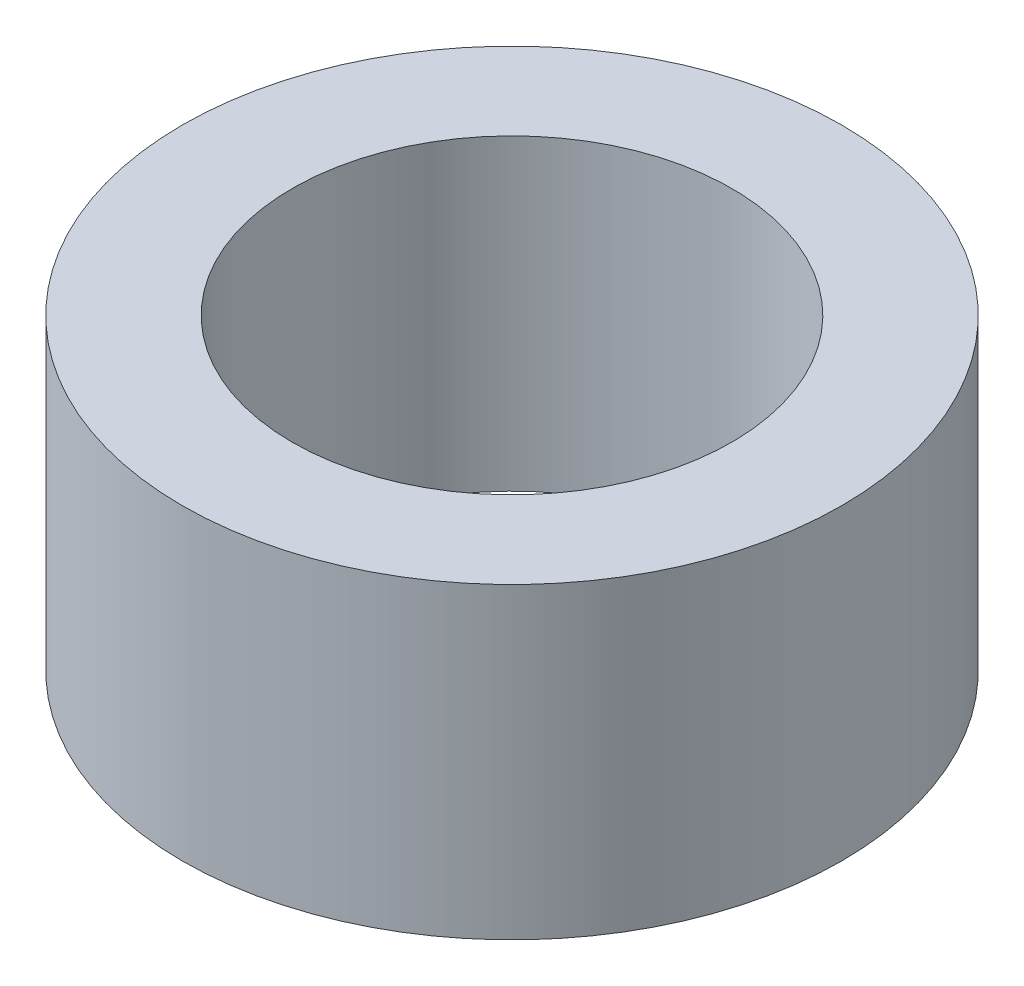
ISO-10303-21;
HEADER;
FILE_DESCRIPTION(('STEP AP214'),'2;1');
FILE_NAME('part.step','',(''),(''),'','','');
FILE_SCHEMA(('AUTOMOTIVE_DESIGN { 1 0 10303 214 1 1 1 1 }'));
ENDSEC;
DATA;
#1=APPLICATION_CONTEXT('core data for automotive mechanical design processes');
#2=APPLICATION_PROTOCOL_DEFINITION('international standard','automotive_design',2000,#1);
#3=PRODUCT_CONTEXT('',#1,'mechanical');
#4=PRODUCT('Part','Part','',(#3));
#5=PRODUCT_RELATED_PRODUCT_CATEGORY('part','',(#4));
#6=PRODUCT_DEFINITION_FORMATION('','',#4);
#7=PRODUCT_DEFINITION_CONTEXT('part definition',#1,'design');
#8=PRODUCT_DEFINITION('design','',#6,#7);
#9=PRODUCT_DEFINITION_SHAPE('','',#8);
#10=(LENGTH_UNIT() NAMED_UNIT(*) SI_UNIT(.MILLI.,.METRE.));
#11=(NAMED_UNIT(*) PLANE_ANGLE_UNIT() SI_UNIT($,.RADIAN.));
#12=(NAMED_UNIT(*) SI_UNIT($,.STERADIAN.) SOLID_ANGLE_UNIT());
#13=UNCERTAINTY_MEASURE_WITH_UNIT(LENGTH_MEASURE(1.E-05),#10,'distance_accuracy_value','');
#14=(GEOMETRIC_REPRESENTATION_CONTEXT(3) GLOBAL_UNCERTAINTY_ASSIGNED_CONTEXT((#13)) GLOBAL_UNIT_ASSIGNED_CONTEXT((#10,
#11,#12)) REPRESENTATION_CONTEXT('',''));
#15=CARTESIAN_POINT('',(0.,0.,0.));
#16=DIRECTION('',(0.,0.,1.));
#17=DIRECTION('',(1.,0.,0.));
#18=AXIS2_PLACEMENT_3D('',#15,#16,#17);
#19=CARTESIAN_POINT('',(0.,28.,0.));
#20=DIRECTION('',(0.,1.,0.));
#21=DIRECTION('',(0.,0.,1.));
#22=AXIS2_PLACEMENT_3D('',#19,#20,#21);
#23=PLANE('',#22);
#24=CARTESIAN_POINT('',(0.,28.,0.));
#25=DIRECTION('',(0.,1.,0.));
#26=DIRECTION('',(0.,0.,1.));
#27=AXIS2_PLACEMENT_3D('',#24,#25,#26);
#28=CIRCLE('',#27,30.);
#29=CARTESIAN_POINT('',(0.,28.,30.));
#30=VERTEX_POINT('',#29);
#31=EDGE_CURVE('E10',#30,#30,#28,.T.);
#32=ORIENTED_EDGE('',*,*,#31,.T.);
#33=EDGE_LOOP('',(#32));
#34=FACE_BOUND('',#33,.T.);
#35=CARTESIAN_POINT('',(0.,28.,0.));
#36=DIRECTION('',(0.,1.,0.));
#37=DIRECTION('',(0.,0.,1.));
#38=AXIS2_PLACEMENT_3D('',#35,#36,#37);
#39=CIRCLE('',#38,20.);
#40=CARTESIAN_POINT('',(0.,28.,20.));
#41=VERTEX_POINT('',#40);
#42=EDGE_CURVE('E52',#41,#41,#39,.T.);
#43=ORIENTED_EDGE('',*,*,#42,.F.);
#44=EDGE_LOOP('',(#43));
#45=FACE_BOUND('',#44,.T.);
#46=ADVANCED_FACE('F39',(#34,#45),#23,.T.);
#47=CARTESIAN_POINT('',(0.,0.,0.));
#48=DIRECTION('',(0.,1.,0.));
#49=DIRECTION('',(0.,0.,1.));
#50=AXIS2_PLACEMENT_3D('',#47,#48,#49);
#51=PLANE('',#50);
#52=CARTESIAN_POINT('',(0.,0.,0.));
#53=DIRECTION('',(0.,1.,0.));
#54=DIRECTION('',(0.,0.,1.));
#55=AXIS2_PLACEMENT_3D('',#52,#53,#54);
#56=CIRCLE('',#55,30.);
#57=CARTESIAN_POINT('',(0.,0.,30.));
#58=VERTEX_POINT('',#57);
#59=EDGE_CURVE('E43',#58,#58,#56,.T.);
#60=ORIENTED_EDGE('',*,*,#59,.F.);
#61=EDGE_LOOP('',(#60));
#62=FACE_BOUND('',#61,.T.);
#63=CARTESIAN_POINT('',(0.,0.,0.));
#64=DIRECTION('',(0.,1.,0.));
#65=DIRECTION('',(0.,0.,1.));
#66=AXIS2_PLACEMENT_3D('',#63,#64,#65);
#67=CIRCLE('',#66,20.);
#68=CARTESIAN_POINT('',(0.,0.,20.));
#69=VERTEX_POINT('',#68);
#70=EDGE_CURVE('E54',#69,#69,#67,.T.);
#71=ORIENTED_EDGE('',*,*,#70,.T.);
#72=EDGE_LOOP('',(#71));
#73=FACE_BOUND('',#72,.T.);
#74=ADVANCED_FACE('F66',(#62,#73),#51,.F.);
#75=CARTESIAN_POINT('',(0.,28.,0.));
#76=DIRECTION('',(0.,-1.,0.));
#77=DIRECTION('',(0.,0.,-1.));
#78=AXIS2_PLACEMENT_3D('',#75,#76,#77);
#79=CYLINDRICAL_SURFACE('',#78,30.);
#80=ORIENTED_EDGE('',*,*,#31,.F.);
#81=EDGE_LOOP('',(#80));
#82=FACE_BOUND('',#81,.T.);
#83=ORIENTED_EDGE('',*,*,#59,.T.);
#84=EDGE_LOOP('',(#83));
#85=FACE_BOUND('',#84,.T.);
#86=ADVANCED_FACE('F41',(#82,#85),#79,.T.);
#87=CARTESIAN_POINT('',(0.,28.,0.));
#88=DIRECTION('',(0.,-1.,0.));
#89=DIRECTION('',(0.,0.,-1.));
#90=AXIS2_PLACEMENT_3D('',#87,#88,#89);
#91=CYLINDRICAL_SURFACE('',#90,20.);
#92=ORIENTED_EDGE('',*,*,#42,.T.);
#93=EDGE_LOOP('',(#92));
#94=FACE_BOUND('',#93,.T.);
#95=ORIENTED_EDGE('',*,*,#70,.F.);
#96=EDGE_LOOP('',(#95));
#97=FACE_BOUND('',#96,.T.);
#98=ADVANCED_FACE('F62',(#94,#97),#91,.F.);
#99=CLOSED_SHELL('',(#46,#74,#86,#98));
#100=MANIFOLD_SOLID_BREP('B2',#99);
#101=ADVANCED_BREP_SHAPE_REPRESENTATION('',(#18,#100),#14);
#102=SHAPE_DEFINITION_REPRESENTATION(#9,#101);
ENDSEC;
END-ISO-10303-21;
